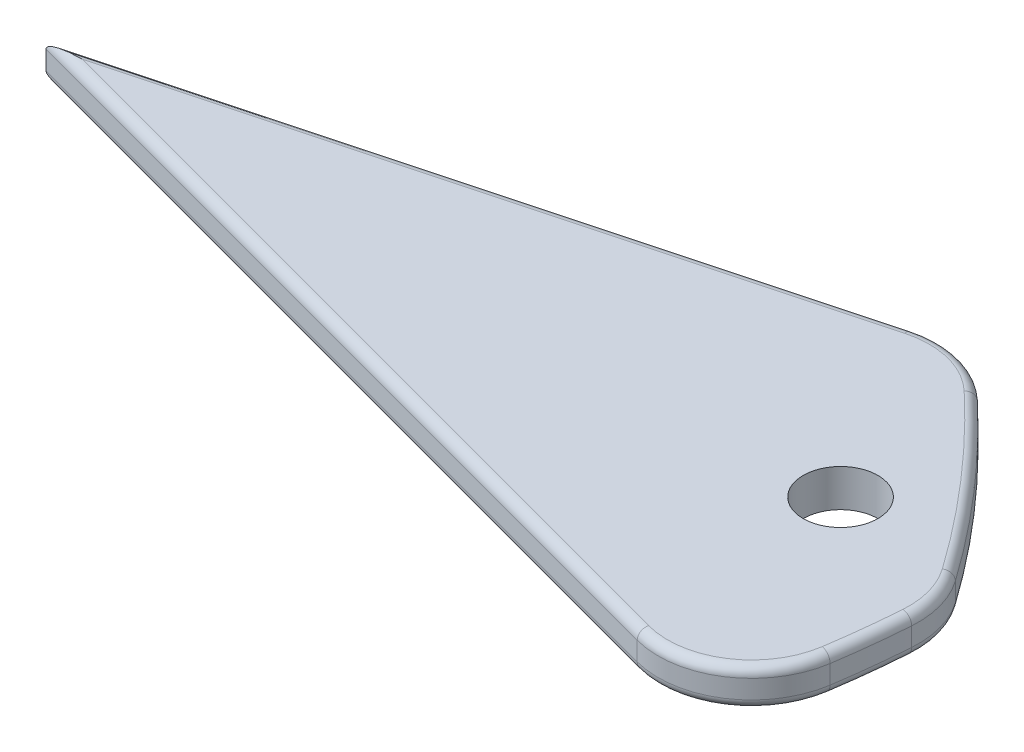
ISO-10303-21;
HEADER;
FILE_DESCRIPTION(('STEP AP214'),'2;1');
FILE_NAME('part.step','',(''),(''),'','','');
FILE_SCHEMA(('AUTOMOTIVE_DESIGN { 1 0 10303 214 1 1 1 1 }'));
ENDSEC;
DATA;
#1=APPLICATION_CONTEXT('core data for automotive mechanical design processes');
#2=APPLICATION_PROTOCOL_DEFINITION('international standard','automotive_design',2000,#1);
#3=PRODUCT_CONTEXT('',#1,'mechanical');
#4=PRODUCT('Part','Part','',(#3));
#5=PRODUCT_RELATED_PRODUCT_CATEGORY('part','',(#4));
#6=PRODUCT_DEFINITION_FORMATION('','',#4);
#7=PRODUCT_DEFINITION_CONTEXT('part definition',#1,'design');
#8=PRODUCT_DEFINITION('design','',#6,#7);
#9=PRODUCT_DEFINITION_SHAPE('','',#8);
#10=(LENGTH_UNIT() NAMED_UNIT(*) SI_UNIT(.MILLI.,.METRE.));
#11=(NAMED_UNIT(*) PLANE_ANGLE_UNIT() SI_UNIT($,.RADIAN.));
#12=(NAMED_UNIT(*) SI_UNIT($,.STERADIAN.) SOLID_ANGLE_UNIT());
#13=UNCERTAINTY_MEASURE_WITH_UNIT(LENGTH_MEASURE(1.E-05),#10,'distance_accuracy_value','');
#14=(GEOMETRIC_REPRESENTATION_CONTEXT(3) GLOBAL_UNCERTAINTY_ASSIGNED_CONTEXT((#13)) GLOBAL_UNIT_ASSIGNED_CONTEXT((#10,
#11,#12)) REPRESENTATION_CONTEXT('',''));
#15=CARTESIAN_POINT('',(0.,0.,0.));
#16=DIRECTION('',(0.,0.,1.));
#17=DIRECTION('',(1.,0.,0.));
#18=AXIS2_PLACEMENT_3D('',#15,#16,#17);
#19=CARTESIAN_POINT('',(0.,-1.,0.));
#20=DIRECTION('',(0.,-1.,0.));
#21=DIRECTION('',(0.,0.,-1.));
#22=AXIS2_PLACEMENT_3D('',#19,#20,#21);
#23=PLANE('',#22);
#24=DIRECTION('',(-0.965925826289068,0.,0.258819045102521));
#25=VECTOR('',#24,1.);
#26=CARTESIAN_POINT('',(36.6352093565327,-1.,-9.29873667142301));
#27=LINE('',#26,#25);
#28=CARTESIAN_POINT('',(1.93185165257814,-1.,0.));
#29=VERTEX_POINT('',#28);
#30=CARTESIAN_POINT('',(36.6352093565327,-1.,-9.29873667142301));
#31=VERTEX_POINT('',#30);
#32=EDGE_CURVE('E234',#29,#31,#27,.F.);
#33=ORIENTED_EDGE('',*,*,#32,.T.);
#34=CARTESIAN_POINT('',(37.799895059494,-1.,-4.95207045312221));
#35=DIRECTION('',(0.,-1.,0.));
#36=DIRECTION('',(0.,0.,-1.));
#37=AXIS2_PLACEMENT_3D('',#34,#35,#36);
#38=CIRCLE('',#37,4.5);
#39=CARTESIAN_POINT('',(40.8926137461799,-1.,-8.22087621746856));
#40=VERTEX_POINT('',#39);
#41=EDGE_CURVE('E246',#31,#40,#38,.T.);
#42=ORIENTED_EDGE('',*,*,#41,.T.);
#43=CARTESIAN_POINT('',(0.,-1.,35.));
#44=DIRECTION('',(0.,-1.,0.));
#45=DIRECTION('',(0.,0.,-1.));
#46=AXIS2_PLACEMENT_3D('',#43,#44,#45);
#47=CIRCLE('',#46,59.5);
#48=CARTESIAN_POINT('',(48.5574710612875,-1.,0.61363636363637));
#49=VERTEX_POINT('',#48);
#50=EDGE_CURVE('E244',#40,#49,#47,.T.);
#51=ORIENTED_EDGE('',*,*,#50,.T.);
#52=CARTESIAN_POINT('',(44.885057283543,-1.,3.21428571428573));
#53=DIRECTION('',(0.,-1.,0.));
#54=DIRECTION('',(0.,0.,-1.));
#55=AXIS2_PLACEMENT_3D('',#52,#53,#54);
#56=CIRCLE('',#55,4.5);
#57=CARTESIAN_POINT('',(49.3735630118973,-1.,3.5357142857143));
#58=VERTEX_POINT('',#57);
#59=EDGE_CURVE('E242',#49,#58,#56,.T.);
#60=ORIENTED_EDGE('',*,*,#59,.T.);
#61=CARTESIAN_POINT('',(0.,-1.,0.));
#62=DIRECTION('',(0.,-1.,0.));
#63=DIRECTION('',(0.,0.,-1.));
#64=AXIS2_PLACEMENT_3D('',#61,#62,#63);
#65=CIRCLE('',#64,49.5);
#66=CARTESIAN_POINT('',(48.9407725417741,-1.,7.41962148726819));
#67=VERTEX_POINT('',#66);
#68=EDGE_CURVE('E240',#58,#67,#65,.T.);
#69=ORIENTED_EDGE('',*,*,#68,.T.);
#70=CARTESIAN_POINT('',(44.4916114016128,-1.,6.74511044297109));
#71=DIRECTION('',(0.,-1.,0.));
#72=DIRECTION('',(0.,0.,-1.));
#73=AXIS2_PLACEMENT_3D('',#70,#71,#72);
#74=CIRCLE('',#73,4.5);
#75=CARTESIAN_POINT('',(43.3269256986515,-1.,11.0917766612719));
#76=VERTEX_POINT('',#75);
#77=EDGE_CURVE('E238',#67,#76,#74,.T.);
#78=ORIENTED_EDGE('',*,*,#77,.T.);
#79=DIRECTION('',(-0.965925826289068,0.,-0.258819045102521));
#80=VECTOR('',#79,1.);
#81=CARTESIAN_POINT('',(0.129409522551261,-1.,-0.482962913144534));
#82=LINE('',#81,#80);
#83=EDGE_CURVE('E236',#76,#29,#82,.T.);
#84=ORIENTED_EDGE('',*,*,#83,.T.);
#85=EDGE_LOOP('',(#33,#42,#51,#60,#69,#78,#84));
#86=FACE_BOUND('',#85,.T.);
#87=CARTESIAN_POINT('',(42.5,-1.,0.));
#88=DIRECTION('',(0.,1.,0.));
#89=DIRECTION('',(0.,0.,1.));
#90=AXIS2_PLACEMENT_3D('',#87,#88,#89);
#91=CIRCLE('',#90,2.);
#92=CARTESIAN_POINT('',(42.5,-1.,2.));
#93=VERTEX_POINT('',#92);
#94=EDGE_CURVE('E187',#93,#93,#91,.T.);
#95=ORIENTED_EDGE('',*,*,#94,.T.);
#96=EDGE_LOOP('',(#95));
#97=FACE_BOUND('',#96,.T.);
#98=DIRECTION('',(0.,0.,-1.));
#99=VECTOR('',#98,1.);
#100=CARTESIAN_POINT('',(37.5,-1.,7.));
#101=LINE('',#100,#99);
#102=CARTESIAN_POINT('',(37.5,-1.,7.));
#103=VERTEX_POINT('',#102);
#104=CARTESIAN_POINT('',(37.5,-1.,-6.99999999999999));
#105=VERTEX_POINT('',#104);
#106=EDGE_CURVE('E637',#103,#105,#101,.T.);
#107=ORIENTED_EDGE('',*,*,#106,.F.);
#108=CARTESIAN_POINT('',(38.,-1.,7.));
#109=DIRECTION('',(0.,-1.,0.));
#110=DIRECTION('',(0.,0.,-1.));
#111=AXIS2_PLACEMENT_3D('',#108,#109,#110);
#112=CIRCLE('',#111,0.5);
#113=CARTESIAN_POINT('',(38.5,-1.,7.));
#114=VERTEX_POINT('',#113);
#115=EDGE_CURVE('E182',#114,#103,#112,.T.);
#116=ORIENTED_EDGE('',*,*,#115,.F.);
#117=DIRECTION('',(0.,0.,1.));
#118=VECTOR('',#117,1.);
#119=CARTESIAN_POINT('',(38.5,-1.,7.));
#120=LINE('',#119,#118);
#121=CARTESIAN_POINT('',(38.5,-1.,-6.99999999999999));
#122=VERTEX_POINT('',#121);
#123=EDGE_CURVE('E178',#122,#114,#120,.T.);
#124=ORIENTED_EDGE('',*,*,#123,.F.);
#125=CARTESIAN_POINT('',(38.,-1.,-6.99999999999999));
#126=DIRECTION('',(0.,-1.,0.));
#127=DIRECTION('',(0.,0.,-1.));
#128=AXIS2_PLACEMENT_3D('',#125,#126,#127);
#129=CIRCLE('',#128,0.5);
#130=EDGE_CURVE('E634',#105,#122,#129,.T.);
#131=ORIENTED_EDGE('',*,*,#130,.F.);
#132=EDGE_LOOP('',(#107,#116,#124,#131));
#133=FACE_BOUND('',#132,.T.);
#134=ADVANCED_FACE('F32',(#86,#97,#133),#23,.T.);
#135=CARTESIAN_POINT('',(0.,1.,0.));
#136=DIRECTION('',(0.,-1.,0.));
#137=DIRECTION('',(0.,0.,-1.));
#138=AXIS2_PLACEMENT_3D('',#135,#136,#137);
#139=PLANE('',#138);
#140=CARTESIAN_POINT('',(0.,1.,35.));
#141=DIRECTION('',(0.,-1.,0.));
#142=DIRECTION('',(0.,0.,-1.));
#143=AXIS2_PLACEMENT_3D('',#140,#141,#142);
#144=CIRCLE('',#143,59.5);
#145=CARTESIAN_POINT('',(48.5574710612875,1.,0.613636363636371));
#146=VERTEX_POINT('',#145);
#147=CARTESIAN_POINT('',(40.8926137461799,1.,-8.22087621746856));
#148=VERTEX_POINT('',#147);
#149=EDGE_CURVE('E221',#146,#148,#144,.F.);
#150=ORIENTED_EDGE('',*,*,#149,.T.);
#151=CARTESIAN_POINT('',(37.799895059494,1.,-4.95207045312221));
#152=DIRECTION('',(0.,-1.,0.));
#153=DIRECTION('',(0.,0.,-1.));
#154=AXIS2_PLACEMENT_3D('',#151,#152,#153);
#155=CIRCLE('',#154,4.5);
#156=CARTESIAN_POINT('',(36.6352093565327,1.,-9.29873667142301));
#157=VERTEX_POINT('',#156);
#158=EDGE_CURVE('E225',#148,#157,#155,.F.);
#159=ORIENTED_EDGE('',*,*,#158,.T.);
#160=DIRECTION('',(-0.965925826289068,0.,0.258819045102521));
#161=VECTOR('',#160,1.);
#162=CARTESIAN_POINT('',(0.129409522551261,1.,0.482962913144534));
#163=LINE('',#162,#161);
#164=CARTESIAN_POINT('',(1.93185165257814,1.,0.));
#165=VERTEX_POINT('',#164);
#166=EDGE_CURVE('E223',#157,#165,#163,.T.);
#167=ORIENTED_EDGE('',*,*,#166,.T.);
#168=DIRECTION('',(-0.965925826289068,0.,-0.258819045102521));
#169=VECTOR('',#168,1.);
#170=CARTESIAN_POINT('',(43.3269256986515,1.,11.0917766612719));
#171=LINE('',#170,#169);
#172=CARTESIAN_POINT('',(43.3269256986515,1.,11.0917766612719));
#173=VERTEX_POINT('',#172);
#174=EDGE_CURVE('E213',#165,#173,#171,.F.);
#175=ORIENTED_EDGE('',*,*,#174,.T.);
#176=CARTESIAN_POINT('',(44.4916114016128,1.,6.74511044297109));
#177=DIRECTION('',(0.,-1.,0.));
#178=DIRECTION('',(0.,0.,-1.));
#179=AXIS2_PLACEMENT_3D('',#176,#177,#178);
#180=CIRCLE('',#179,4.5);
#181=CARTESIAN_POINT('',(48.9407725417741,1.,7.41962148726819));
#182=VERTEX_POINT('',#181);
#183=EDGE_CURVE('E215',#173,#182,#180,.F.);
#184=ORIENTED_EDGE('',*,*,#183,.T.);
#185=CARTESIAN_POINT('',(0.,1.,0.));
#186=DIRECTION('',(0.,-1.,0.));
#187=DIRECTION('',(0.,0.,-1.));
#188=AXIS2_PLACEMENT_3D('',#185,#186,#187);
#189=CIRCLE('',#188,49.5);
#190=CARTESIAN_POINT('',(49.3735630118973,1.,3.5357142857143));
#191=VERTEX_POINT('',#190);
#192=EDGE_CURVE('E217',#182,#191,#189,.F.);
#193=ORIENTED_EDGE('',*,*,#192,.T.);
#194=CARTESIAN_POINT('',(44.885057283543,1.,3.21428571428573));
#195=DIRECTION('',(0.,-1.,0.));
#196=DIRECTION('',(0.,0.,-1.));
#197=AXIS2_PLACEMENT_3D('',#194,#195,#196);
#198=CIRCLE('',#197,4.5);
#199=EDGE_CURVE('E219',#191,#146,#198,.F.);
#200=ORIENTED_EDGE('',*,*,#199,.T.);
#201=EDGE_LOOP('',(#150,#159,#167,#175,#184,#193,#200));
#202=FACE_BOUND('',#201,.T.);
#203=CARTESIAN_POINT('',(42.5,1.,0.));
#204=DIRECTION('',(0.,1.,0.));
#205=DIRECTION('',(0.,0.,1.));
#206=AXIS2_PLACEMENT_3D('',#203,#204,#205);
#207=CIRCLE('',#206,2.);
#208=CARTESIAN_POINT('',(42.5,1.,2.));
#209=VERTEX_POINT('',#208);
#210=EDGE_CURVE('E184',#209,#209,#207,.T.);
#211=ORIENTED_EDGE('',*,*,#210,.F.);
#212=EDGE_LOOP('',(#211));
#213=FACE_BOUND('',#212,.T.);
#214=ADVANCED_FACE('F403',(#202,#213),#139,.F.);
#215=CARTESIAN_POINT('',(48.2962913144534,1.,-12.9409522551261));
#216=DIRECTION('',(0.258819045102521,0.,0.965925826289068));
#217=DIRECTION('',(0.965925826289068,0.,-0.258819045102521));
#218=AXIS2_PLACEMENT_3D('',#215,#216,#217);
#219=PLANE('',#218);
#220=DIRECTION('',(0.,-1.,0.));
#221=VECTOR('',#220,1.);
#222=CARTESIAN_POINT('',(36.5057998339814,-1.,-9.78169958456754));
#223=LINE('',#222,#221);
#224=CARTESIAN_POINT('',(36.5057998339814,0.5,-9.78169958456754));
#225=VERTEX_POINT('',#224);
#226=CARTESIAN_POINT('',(36.5057998339814,-0.5,-9.78169958456754));
#227=VERTEX_POINT('',#226);
#228=EDGE_CURVE('E197',#225,#227,#223,.T.);
#229=ORIENTED_EDGE('',*,*,#228,.T.);
#230=DIRECTION('',(-0.965925826289068,0.,0.258819045102521));
#231=VECTOR('',#230,1.);
#232=CARTESIAN_POINT('',(0.,-0.5,0.));
#233=LINE('',#232,#231);
#234=CARTESIAN_POINT('',(0.,-0.5,0.));
#235=VERTEX_POINT('',#234);
#236=EDGE_CURVE('E11',#227,#235,#233,.T.);
#237=ORIENTED_EDGE('',*,*,#236,.T.);
#238=DIRECTION('',(0.,-1.,0.));
#239=VECTOR('',#238,1.);
#240=CARTESIAN_POINT('',(0.,1.,0.));
#241=LINE('',#240,#239);
#242=CARTESIAN_POINT('',(0.,0.5,0.));
#243=VERTEX_POINT('',#242);
#244=EDGE_CURVE('E194',#243,#235,#241,.T.);
#245=ORIENTED_EDGE('',*,*,#244,.F.);
#246=DIRECTION('',(-0.965925826289068,0.,0.258819045102521));
#247=VECTOR('',#246,1.);
#248=CARTESIAN_POINT('',(48.2962913144534,0.5,-12.9409522551261));
#249=LINE('',#248,#247);
#250=EDGE_CURVE('E41',#243,#225,#249,.F.);
#251=ORIENTED_EDGE('',*,*,#250,.T.);
#252=EDGE_LOOP('',(#229,#237,#245,#251));
#253=FACE_BOUND('',#252,.T.);
#254=ADVANCED_FACE('F366',(#253),#219,.F.);
#255=CARTESIAN_POINT('',(48.2962913144534,1.,12.9409522551261));
#256=DIRECTION('',(-0.258819045102521,0.,0.965925826289068));
#257=DIRECTION('',(0.965925826289068,0.,0.258819045102521));
#258=AXIS2_PLACEMENT_3D('',#255,#256,#257);
#259=PLANE('',#258);
#260=ORIENTED_EDGE('',*,*,#244,.T.);
#261=DIRECTION('',(-0.965925826289068,0.,-0.258819045102521));
#262=VECTOR('',#261,1.);
#263=CARTESIAN_POINT('',(48.2962913144534,-0.5,12.9409522551261));
#264=LINE('',#263,#262);
#265=CARTESIAN_POINT('',(43.1975161761002,-0.5,11.5747395744164));
#266=VERTEX_POINT('',#265);
#267=EDGE_CURVE('E266',#235,#266,#264,.F.);
#268=ORIENTED_EDGE('',*,*,#267,.T.);
#269=DIRECTION('',(0.,-1.,0.));
#270=VECTOR('',#269,1.);
#271=CARTESIAN_POINT('',(43.1975161761002,1.,11.5747395744164));
#272=LINE('',#271,#270);
#273=CARTESIAN_POINT('',(43.1975161761002,0.5,11.5747395744164));
#274=VERTEX_POINT('',#273);
#275=EDGE_CURVE('E211',#266,#274,#272,.F.);
#276=ORIENTED_EDGE('',*,*,#275,.T.);
#277=DIRECTION('',(-0.965925826289068,0.,-0.258819045102521));
#278=VECTOR('',#277,1.);
#279=CARTESIAN_POINT('',(0.,0.5,0.));
#280=LINE('',#279,#278);
#281=EDGE_CURVE('E54',#274,#243,#280,.T.);
#282=ORIENTED_EDGE('',*,*,#281,.T.);
#283=EDGE_LOOP('',(#260,#268,#276,#282));
#284=FACE_BOUND('',#283,.T.);
#285=ADVANCED_FACE('F347',(#284),#259,.T.);
#286=CARTESIAN_POINT('',(0.,1.,0.));
#287=DIRECTION('',(0.,-1.,0.));
#288=DIRECTION('',(0.,0.,-1.));
#289=AXIS2_PLACEMENT_3D('',#286,#287,#288);
#290=CYLINDRICAL_SURFACE('',#289,50.);
#291=DIRECTION('',(0.,-1.,0.));
#292=VECTOR('',#291,1.);
#293=CARTESIAN_POINT('',(49.4351237795698,1.,7.49456715885676));
#294=LINE('',#293,#292);
#295=CARTESIAN_POINT('',(49.4351237795698,0.5,7.49456715885676));
#296=VERTEX_POINT('',#295);
#297=CARTESIAN_POINT('',(49.4351237795698,-0.5,7.49456715885676));
#298=VERTEX_POINT('',#297);
#299=EDGE_CURVE('E205',#296,#298,#294,.T.);
#300=ORIENTED_EDGE('',*,*,#299,.T.);
#301=CARTESIAN_POINT('',(0.,-0.5,0.));
#302=DIRECTION('',(0.,-1.,0.));
#303=DIRECTION('',(0.,0.,-1.));
#304=AXIS2_PLACEMENT_3D('',#301,#302,#303);
#305=CIRCLE('',#304,50.);
#306=CARTESIAN_POINT('',(49.8722858706034,-0.5,3.57142857142858));
#307=VERTEX_POINT('',#306);
#308=EDGE_CURVE('E259',#298,#307,#305,.F.);
#309=ORIENTED_EDGE('',*,*,#308,.T.);
#310=DIRECTION('',(0.,-1.,0.));
#311=VECTOR('',#310,1.);
#312=CARTESIAN_POINT('',(49.8722858706034,1.,3.57142857142858));
#313=LINE('',#312,#311);
#314=CARTESIAN_POINT('',(49.8722858706034,0.5,3.57142857142858));
#315=VERTEX_POINT('',#314);
#316=EDGE_CURVE('E208',#307,#315,#313,.F.);
#317=ORIENTED_EDGE('',*,*,#316,.T.);
#318=CARTESIAN_POINT('',(0.,0.5,0.));
#319=DIRECTION('',(0.,-1.,0.));
#320=DIRECTION('',(0.,0.,-1.));
#321=AXIS2_PLACEMENT_3D('',#318,#319,#320);
#322=CIRCLE('',#321,50.);
#323=EDGE_CURVE('E257',#315,#296,#322,.T.);
#324=ORIENTED_EDGE('',*,*,#323,.T.);
#325=EDGE_LOOP('',(#300,#309,#317,#324));
#326=FACE_BOUND('',#325,.T.);
#327=ADVANCED_FACE('F389',(#326),#290,.T.);
#328=CARTESIAN_POINT('',(42.5,-1.,0.));
#329=DIRECTION('',(0.,1.,0.));
#330=DIRECTION('',(0.,0.,1.));
#331=AXIS2_PLACEMENT_3D('',#328,#329,#330);
#332=CYLINDRICAL_SURFACE('',#331,2.);
#333=ORIENTED_EDGE('',*,*,#94,.F.);
#334=EDGE_LOOP('',(#333));
#335=FACE_BOUND('',#334,.T.);
#336=ORIENTED_EDGE('',*,*,#210,.T.);
#337=EDGE_LOOP('',(#336));
#338=FACE_BOUND('',#337,.T.);
#339=ADVANCED_FACE('F391',(#335,#338),#332,.F.);
#340=CARTESIAN_POINT('',(38.,-1.5,7.));
#341=DIRECTION('',(0.,1.,0.));
#342=DIRECTION('',(0.,0.,1.));
#343=AXIS2_PLACEMENT_3D('',#340,#341,#342);
#344=CYLINDRICAL_SURFACE('',#343,0.5);
#345=ORIENTED_EDGE('',*,*,#115,.T.);
#346=DIRECTION('',(0.,1.,0.));
#347=VECTOR('',#346,1.);
#348=CARTESIAN_POINT('',(37.5,-1.5,7.));
#349=LINE('',#348,#347);
#350=CARTESIAN_POINT('',(37.5,-1.5,7.));
#351=VERTEX_POINT('',#350);
#352=EDGE_CURVE('E162',#351,#103,#349,.T.);
#353=ORIENTED_EDGE('',*,*,#352,.F.);
#354=CARTESIAN_POINT('',(38.,-1.5,7.));
#355=DIRECTION('',(0.,-1.,0.));
#356=DIRECTION('',(0.,0.,-1.));
#357=AXIS2_PLACEMENT_3D('',#354,#355,#356);
#358=CIRCLE('',#357,0.5);
#359=CARTESIAN_POINT('',(38.5,-1.5,7.));
#360=VERTEX_POINT('',#359);
#361=EDGE_CURVE('E169',#360,#351,#358,.T.);
#362=ORIENTED_EDGE('',*,*,#361,.F.);
#363=DIRECTION('',(0.,1.,0.));
#364=VECTOR('',#363,1.);
#365=CARTESIAN_POINT('',(38.5,-1.5,7.));
#366=LINE('',#365,#364);
#367=EDGE_CURVE('E629',#360,#114,#366,.T.);
#368=ORIENTED_EDGE('',*,*,#367,.T.);
#369=EDGE_LOOP('',(#345,#353,#362,#368));
#370=FACE_BOUND('',#369,.T.);
#371=ADVANCED_FACE('F180',(#370),#344,.T.);
#372=CARTESIAN_POINT('',(37.5,-1.5,7.));
#373=DIRECTION('',(1.,0.,0.));
#374=DIRECTION('',(0.,0.,-1.));
#375=AXIS2_PLACEMENT_3D('',#372,#373,#374);
#376=PLANE('',#375);
#377=ORIENTED_EDGE('',*,*,#106,.T.);
#378=DIRECTION('',(0.,1.,0.));
#379=VECTOR('',#378,1.);
#380=CARTESIAN_POINT('',(37.5,-1.5,-6.99999999999999));
#381=LINE('',#380,#379);
#382=CARTESIAN_POINT('',(37.5,-1.5,-6.99999999999999));
#383=VERTEX_POINT('',#382);
#384=EDGE_CURVE('E165',#383,#105,#381,.T.);
#385=ORIENTED_EDGE('',*,*,#384,.F.);
#386=DIRECTION('',(0.,0.,-1.));
#387=VECTOR('',#386,1.);
#388=CARTESIAN_POINT('',(37.5,-1.5,7.));
#389=LINE('',#388,#387);
#390=EDGE_CURVE('E158',#351,#383,#389,.T.);
#391=ORIENTED_EDGE('',*,*,#390,.F.);
#392=ORIENTED_EDGE('',*,*,#352,.T.);
#393=EDGE_LOOP('',(#377,#385,#391,#392));
#394=FACE_BOUND('',#393,.T.);
#395=ADVANCED_FACE('F160',(#394),#376,.F.);
#396=CARTESIAN_POINT('',(38.,-1.5,-6.99999999999999));
#397=DIRECTION('',(0.,1.,0.));
#398=DIRECTION('',(0.,0.,1.));
#399=AXIS2_PLACEMENT_3D('',#396,#397,#398);
#400=CYLINDRICAL_SURFACE('',#399,0.5);
#401=ORIENTED_EDGE('',*,*,#130,.T.);
#402=DIRECTION('',(0.,1.,0.));
#403=VECTOR('',#402,1.);
#404=CARTESIAN_POINT('',(38.5,-1.5,-6.99999999999999));
#405=LINE('',#404,#403);
#406=CARTESIAN_POINT('',(38.5,-1.5,-6.99999999999999));
#407=VERTEX_POINT('',#406);
#408=EDGE_CURVE('E189',#407,#122,#405,.T.);
#409=ORIENTED_EDGE('',*,*,#408,.F.);
#410=CARTESIAN_POINT('',(38.,-1.5,-6.99999999999999));
#411=DIRECTION('',(0.,-1.,0.));
#412=DIRECTION('',(0.,0.,-1.));
#413=AXIS2_PLACEMENT_3D('',#410,#411,#412);
#414=CIRCLE('',#413,0.5);
#415=EDGE_CURVE('E168',#383,#407,#414,.T.);
#416=ORIENTED_EDGE('',*,*,#415,.F.);
#417=ORIENTED_EDGE('',*,*,#384,.T.);
#418=EDGE_LOOP('',(#401,#409,#416,#417));
#419=FACE_BOUND('',#418,.T.);
#420=ADVANCED_FACE('F415',(#419),#400,.T.);
#421=CARTESIAN_POINT('',(38.5,-1.5,7.));
#422=DIRECTION('',(-1.,0.,0.));
#423=DIRECTION('',(0.,0.,1.));
#424=AXIS2_PLACEMENT_3D('',#421,#422,#423);
#425=PLANE('',#424);
#426=ORIENTED_EDGE('',*,*,#123,.T.);
#427=ORIENTED_EDGE('',*,*,#367,.F.);
#428=DIRECTION('',(0.,0.,1.));
#429=VECTOR('',#428,1.);
#430=CARTESIAN_POINT('',(38.5,-1.5,7.));
#431=LINE('',#430,#429);
#432=EDGE_CURVE('E174',#407,#360,#431,.T.);
#433=ORIENTED_EDGE('',*,*,#432,.F.);
#434=ORIENTED_EDGE('',*,*,#408,.T.);
#435=EDGE_LOOP('',(#426,#427,#433,#434));
#436=FACE_BOUND('',#435,.T.);
#437=ADVANCED_FACE('F418',(#436),#425,.F.);
#438=CARTESIAN_POINT('',(38.,-1.5,7.));
#439=DIRECTION('',(0.,-1.,0.));
#440=DIRECTION('',(0.,0.,-1.));
#441=AXIS2_PLACEMENT_3D('',#438,#439,#440);
#442=PLANE('',#441);
#443=ORIENTED_EDGE('',*,*,#361,.T.);
#444=ORIENTED_EDGE('',*,*,#390,.T.);
#445=ORIENTED_EDGE('',*,*,#415,.T.);
#446=ORIENTED_EDGE('',*,*,#432,.T.);
#447=EDGE_LOOP('',(#443,#444,#445,#446));
#448=FACE_BOUND('',#447,.T.);
#449=ADVANCED_FACE('F172',(#448),#442,.T.);
#450=CARTESIAN_POINT('',(0.,-1.501,35.));
#451=DIRECTION('',(0.,1.,0.));
#452=DIRECTION('',(0.,0.,1.));
#453=AXIS2_PLACEMENT_3D('',#450,#451,#452);
#454=CYLINDRICAL_SURFACE('',#453,60.);
#455=DIRECTION('',(0.,1.,0.));
#456=VECTOR('',#455,1.);
#457=CARTESIAN_POINT('',(48.9655170365924,-1.501,0.324675324675325));
#458=LINE('',#457,#456);
#459=CARTESIAN_POINT('',(48.9655170365924,0.5,0.324675324675325));
#460=VERTEX_POINT('',#459);
#461=CARTESIAN_POINT('',(48.9655170365924,-0.5,0.324675324675325));
#462=VERTEX_POINT('',#461);
#463=EDGE_CURVE('E199',#460,#462,#458,.F.);
#464=ORIENTED_EDGE('',*,*,#463,.T.);
#465=CARTESIAN_POINT('',(0.,-0.5,35.));
#466=DIRECTION('',(0.,-1.,0.));
#467=DIRECTION('',(0.,0.,-1.));
#468=AXIS2_PLACEMENT_3D('',#465,#466,#467);
#469=CIRCLE('',#468,60.);
#470=CARTESIAN_POINT('',(41.2362491558116,-0.5,-8.5840768579515));
#471=VERTEX_POINT('',#470);
#472=EDGE_CURVE('E251',#462,#471,#469,.F.);
#473=ORIENTED_EDGE('',*,*,#472,.T.);
#474=DIRECTION('',(0.,1.,0.));
#475=VECTOR('',#474,1.);
#476=CARTESIAN_POINT('',(41.2362491558116,-1.501,-8.5840768579515));
#477=LINE('',#476,#475);
#478=CARTESIAN_POINT('',(41.2362491558116,0.5,-8.5840768579515));
#479=VERTEX_POINT('',#478);
#480=EDGE_CURVE('E202',#471,#479,#477,.T.);
#481=ORIENTED_EDGE('',*,*,#480,.T.);
#482=CARTESIAN_POINT('',(0.,0.5,35.));
#483=DIRECTION('',(0.,-1.,0.));
#484=DIRECTION('',(0.,0.,-1.));
#485=AXIS2_PLACEMENT_3D('',#482,#483,#484);
#486=CIRCLE('',#485,60.);
#487=EDGE_CURVE('E249',#479,#460,#486,.T.);
#488=ORIENTED_EDGE('',*,*,#487,.T.);
#489=EDGE_LOOP('',(#464,#473,#481,#488));
#490=FACE_BOUND('',#489,.T.);
#491=ADVANCED_FACE('F331',(#490),#454,.T.);
#492=CARTESIAN_POINT('',(37.799895059494,-1.501,-4.95207045312221));
#493=DIRECTION('',(0.,1.,0.));
#494=DIRECTION('',(0.,0.,1.));
#495=AXIS2_PLACEMENT_3D('',#492,#493,#494);
#496=CYLINDRICAL_SURFACE('',#495,5.);
#497=ORIENTED_EDGE('',*,*,#228,.F.);
#498=CARTESIAN_POINT('',(37.799895059494,0.5,-4.95207045312221));
#499=DIRECTION('',(0.,-1.,0.));
#500=DIRECTION('',(0.,0.,-1.));
#501=AXIS2_PLACEMENT_3D('',#498,#499,#500);
#502=CIRCLE('',#501,5.);
#503=EDGE_CURVE('E231',#225,#479,#502,.T.);
#504=ORIENTED_EDGE('',*,*,#503,.T.);
#505=ORIENTED_EDGE('',*,*,#480,.F.);
#506=CARTESIAN_POINT('',(37.799895059494,-0.5,-4.95207045312221));
#507=DIRECTION('',(0.,-1.,0.));
#508=DIRECTION('',(0.,0.,-1.));
#509=AXIS2_PLACEMENT_3D('',#506,#507,#508);
#510=CIRCLE('',#509,5.);
#511=EDGE_CURVE('E228',#471,#227,#510,.F.);
#512=ORIENTED_EDGE('',*,*,#511,.T.);
#513=EDGE_LOOP('',(#497,#504,#505,#512));
#514=FACE_BOUND('',#513,.T.);
#515=ADVANCED_FACE('F336',(#514),#496,.T.);
#516=CARTESIAN_POINT('',(44.885057283543,1.,3.21428571428573));
#517=DIRECTION('',(0.,-1.,0.));
#518=DIRECTION('',(0.,0.,-1.));
#519=AXIS2_PLACEMENT_3D('',#516,#517,#518);
#520=CYLINDRICAL_SURFACE('',#519,5.);
#521=ORIENTED_EDGE('',*,*,#316,.F.);
#522=CARTESIAN_POINT('',(44.885057283543,-0.5,3.21428571428573));
#523=DIRECTION('',(0.,-1.,0.));
#524=DIRECTION('',(0.,0.,-1.));
#525=AXIS2_PLACEMENT_3D('',#522,#523,#524);
#526=CIRCLE('',#525,5.);
#527=EDGE_CURVE('E255',#307,#462,#526,.F.);
#528=ORIENTED_EDGE('',*,*,#527,.T.);
#529=ORIENTED_EDGE('',*,*,#463,.F.);
#530=CARTESIAN_POINT('',(44.885057283543,0.5,3.21428571428573));
#531=DIRECTION('',(0.,-1.,0.));
#532=DIRECTION('',(0.,0.,-1.));
#533=AXIS2_PLACEMENT_3D('',#530,#531,#532);
#534=CIRCLE('',#533,5.);
#535=EDGE_CURVE('E253',#460,#315,#534,.T.);
#536=ORIENTED_EDGE('',*,*,#535,.T.);
#537=EDGE_LOOP('',(#521,#528,#529,#536));
#538=FACE_BOUND('',#537,.T.);
#539=ADVANCED_FACE('F379',(#538),#520,.T.);
#540=CARTESIAN_POINT('',(44.4916114016128,1.,6.74511044297109));
#541=DIRECTION('',(0.,-1.,0.));
#542=DIRECTION('',(0.,0.,-1.));
#543=AXIS2_PLACEMENT_3D('',#540,#541,#542);
#544=CYLINDRICAL_SURFACE('',#543,5.);
#545=ORIENTED_EDGE('',*,*,#275,.F.);
#546=CARTESIAN_POINT('',(44.4916114016128,-0.5,6.74511044297109));
#547=DIRECTION('',(0.,-1.,0.));
#548=DIRECTION('',(0.,0.,-1.));
#549=AXIS2_PLACEMENT_3D('',#546,#547,#548);
#550=CIRCLE('',#549,5.);
#551=EDGE_CURVE('E263',#266,#298,#550,.F.);
#552=ORIENTED_EDGE('',*,*,#551,.T.);
#553=ORIENTED_EDGE('',*,*,#299,.F.);
#554=CARTESIAN_POINT('',(44.4916114016128,0.5,6.74511044297109));
#555=DIRECTION('',(0.,-1.,0.));
#556=DIRECTION('',(0.,0.,-1.));
#557=AXIS2_PLACEMENT_3D('',#554,#555,#556);
#558=CIRCLE('',#557,5.);
#559=EDGE_CURVE('E261',#296,#274,#558,.T.);
#560=ORIENTED_EDGE('',*,*,#559,.T.);
#561=EDGE_LOOP('',(#545,#552,#553,#560));
#562=FACE_BOUND('',#561,.T.);
#563=ADVANCED_FACE('F350',(#562),#544,.T.);
#564=CARTESIAN_POINT('',(0.,0.5,0.));
#565=DIRECTION('',(0.,-1.,0.));
#566=DIRECTION('',(0.,0.,-1.));
#567=AXIS2_PLACEMENT_3D('',#564,#565,#566);
#568=TOROIDAL_SURFACE('',#567,49.5,0.5);
#569=CARTESIAN_POINT('',(49.3735630118973,0.5,3.5357142857143));
#570=DIRECTION('',(0.0714285714285716,0.,-0.997445717412067));
#571=DIRECTION('',(-0.997445717412067,0.,-0.0714285714285716));
#572=AXIS2_PLACEMENT_3D('',#569,#570,#571);
#573=CIRCLE('',#572,0.5);
#574=EDGE_CURVE('E282',#191,#315,#573,.T.);
#575=ORIENTED_EDGE('',*,*,#574,.F.);
#576=ORIENTED_EDGE('',*,*,#192,.F.);
#577=CARTESIAN_POINT('',(48.9407725417741,0.5,7.41962148726819));
#578=DIRECTION('',(-0.149891343177136,0.,0.988702475591396));
#579=DIRECTION('',(0.988702475591396,0.,0.149891343177136));
#580=AXIS2_PLACEMENT_3D('',#577,#578,#579);
#581=CIRCLE('',#580,0.5);
#582=EDGE_CURVE('E285',#296,#182,#581,.T.);
#583=ORIENTED_EDGE('',*,*,#582,.F.);
#584=ORIENTED_EDGE('',*,*,#323,.F.);
#585=EDGE_LOOP('',(#575,#576,#583,#584));
#586=FACE_BOUND('',#585,.T.);
#587=ADVANCED_FACE('F387',(#586),#568,.T.);
#588=CARTESIAN_POINT('',(44.4916114016128,0.5,6.74511044297109));
#589=DIRECTION('',(0.,-1.,0.));
#590=DIRECTION('',(0.,0.,-1.));
#591=AXIS2_PLACEMENT_3D('',#588,#589,#590);
#592=TOROIDAL_SURFACE('',#591,4.5,0.5);
#593=ORIENTED_EDGE('',*,*,#582,.T.);
#594=ORIENTED_EDGE('',*,*,#183,.F.);
#595=CARTESIAN_POINT('',(43.3269256986515,0.5,11.0917766612719));
#596=DIRECTION('',(-0.965925826289067,0.,-0.258819045102526));
#597=DIRECTION('',(-0.258819045102526,0.,0.965925826289067));
#598=AXIS2_PLACEMENT_3D('',#595,#596,#597);
#599=CIRCLE('',#598,0.5);
#600=EDGE_CURVE('E279',#274,#173,#599,.T.);
#601=ORIENTED_EDGE('',*,*,#600,.F.);
#602=ORIENTED_EDGE('',*,*,#559,.F.);
#603=EDGE_LOOP('',(#593,#594,#601,#602));
#604=FACE_BOUND('',#603,.T.);
#605=ADVANCED_FACE('F355',(#604),#592,.T.);
#606=CARTESIAN_POINT('',(44.885057283543,0.5,3.21428571428573));
#607=DIRECTION('',(0.,-1.,0.));
#608=DIRECTION('',(0.,0.,-1.));
#609=AXIS2_PLACEMENT_3D('',#606,#607,#608);
#610=TOROIDAL_SURFACE('',#609,4.5,0.5);
#611=ORIENTED_EDGE('',*,*,#574,.T.);
#612=ORIENTED_EDGE('',*,*,#535,.F.);
#613=CARTESIAN_POINT('',(48.5574710612875,0.5,0.613636363636371));
#614=DIRECTION('',(-0.577922077922083,0.,-0.81609195060987));
#615=DIRECTION('',(-0.816091950609869,0.,0.577922077922083));
#616=AXIS2_PLACEMENT_3D('',#613,#614,#615);
#617=CIRCLE('',#616,0.5);
#618=EDGE_CURVE('E276',#146,#460,#617,.T.);
#619=ORIENTED_EDGE('',*,*,#618,.F.);
#620=ORIENTED_EDGE('',*,*,#199,.F.);
#621=EDGE_LOOP('',(#611,#612,#619,#620));
#622=FACE_BOUND('',#621,.T.);
#623=ADVANCED_FACE('F381',(#622),#610,.T.);
#624=CARTESIAN_POINT('',(48.4257008370047,0.5,12.4579893419815));
#625=DIRECTION('',(0.965925826289068,0.,0.258819045102521));
#626=DIRECTION('',(0.258819045102521,0.,-0.965925826289068));
#627=AXIS2_PLACEMENT_3D('',#624,#625,#626);
#628=CYLINDRICAL_SURFACE('',#627,0.5);
#629=ORIENTED_EDGE('',*,*,#600,.T.);
#630=ORIENTED_EDGE('',*,*,#174,.F.);
#631=CARTESIAN_POINT('',(1.93185165257819,0.5,0.));
#632=DIRECTION('',(0.,0.,1.));
#633=DIRECTION('',(1.,0.,0.));
#634=AXIS2_PLACEMENT_3D('',#631,#632,#633);
#635=ELLIPSE('',#634,1.93185165257814,0.5);
#636=EDGE_CURVE('E273',#243,#165,#635,.F.);
#637=ORIENTED_EDGE('',*,*,#636,.F.);
#638=ORIENTED_EDGE('',*,*,#281,.F.);
#639=EDGE_LOOP('',(#629,#630,#637,#638));
#640=FACE_BOUND('',#639,.T.);
#641=ADVANCED_FACE('F360',(#640),#628,.T.);
#642=CARTESIAN_POINT('',(0.,0.5,35.));
#643=DIRECTION('',(0.,-1.,0.));
#644=DIRECTION('',(0.,0.,-1.));
#645=AXIS2_PLACEMENT_3D('',#642,#643,#644);
#646=TOROIDAL_SURFACE('',#645,59.5,0.5);
#647=ORIENTED_EDGE('',*,*,#618,.T.);
#648=ORIENTED_EDGE('',*,*,#487,.F.);
#649=CARTESIAN_POINT('',(40.8926137461799,0.5,-8.22087621746856));
#650=DIRECTION('',(-0.72640128096586,0.,-0.687270819263526));
#651=DIRECTION('',(-0.687270819263526,0.,0.72640128096586));
#652=AXIS2_PLACEMENT_3D('',#649,#650,#651);
#653=CIRCLE('',#652,0.5);
#654=EDGE_CURVE('E271',#148,#479,#653,.T.);
#655=ORIENTED_EDGE('',*,*,#654,.F.);
#656=ORIENTED_EDGE('',*,*,#149,.F.);
#657=EDGE_LOOP('',(#647,#648,#655,#656));
#658=FACE_BOUND('',#657,.T.);
#659=ADVANCED_FACE('F374',(#658),#646,.T.);
#660=CARTESIAN_POINT('',(0.129409522551261,0.5,0.482962913144534));
#661=DIRECTION('',(-0.965925826289068,0.,0.258819045102521));
#662=DIRECTION('',(0.258819045102521,0.,0.965925826289068));
#663=AXIS2_PLACEMENT_3D('',#660,#661,#662);
#664=CYLINDRICAL_SURFACE('',#663,0.5);
#665=ORIENTED_EDGE('',*,*,#636,.T.);
#666=ORIENTED_EDGE('',*,*,#166,.F.);
#667=CARTESIAN_POINT('',(36.6352093565327,0.5,-9.29873667142301));
#668=DIRECTION('',(0.965925826289067,0.,-0.258819045102526));
#669=DIRECTION('',(-0.258819045102526,0.,-0.965925826289067));
#670=AXIS2_PLACEMENT_3D('',#667,#668,#669);
#671=CIRCLE('',#670,0.5);
#672=EDGE_CURVE('E269',#225,#157,#671,.T.);
#673=ORIENTED_EDGE('',*,*,#672,.F.);
#674=ORIENTED_EDGE('',*,*,#250,.F.);
#675=EDGE_LOOP('',(#665,#666,#673,#674));
#676=FACE_BOUND('',#675,.T.);
#677=ADVANCED_FACE('F365',(#676),#664,.T.);
#678=CARTESIAN_POINT('',(37.799895059494,0.5,-4.95207045312221));
#679=DIRECTION('',(0.,-1.,0.));
#680=DIRECTION('',(0.,0.,-1.));
#681=AXIS2_PLACEMENT_3D('',#678,#679,#680);
#682=TOROIDAL_SURFACE('',#681,4.5,0.5);
#683=ORIENTED_EDGE('',*,*,#654,.T.);
#684=ORIENTED_EDGE('',*,*,#503,.F.);
#685=ORIENTED_EDGE('',*,*,#672,.T.);
#686=ORIENTED_EDGE('',*,*,#158,.F.);
#687=EDGE_LOOP('',(#683,#684,#685,#686));
#688=FACE_BOUND('',#687,.T.);
#689=ADVANCED_FACE('F368',(#688),#682,.T.);
#690=CARTESIAN_POINT('',(44.4916114016128,-0.5,6.74511044297109));
#691=DIRECTION('',(0.,-1.,0.));
#692=DIRECTION('',(0.,0.,-1.));
#693=AXIS2_PLACEMENT_3D('',#690,#691,#692);
#694=TOROIDAL_SURFACE('',#693,4.5,0.5);
#695=CARTESIAN_POINT('',(43.3269256986515,-0.5,11.0917766612719));
#696=DIRECTION('',(-0.965925826289067,0.,-0.258819045102526));
#697=DIRECTION('',(-0.258819045102526,0.,0.965925826289067));
#698=AXIS2_PLACEMENT_3D('',#695,#696,#697);
#699=CIRCLE('',#698,0.5);
#700=EDGE_CURVE('E300',#76,#266,#699,.T.);
#701=ORIENTED_EDGE('',*,*,#700,.F.);
#702=ORIENTED_EDGE('',*,*,#77,.F.);
#703=CARTESIAN_POINT('',(48.9407725417741,-0.5,7.41962148726819));
#704=DIRECTION('',(0.149891343177136,0.,-0.988702475591396));
#705=DIRECTION('',(-0.988702475591396,0.,-0.149891343177136));
#706=AXIS2_PLACEMENT_3D('',#703,#704,#705);
#707=CIRCLE('',#706,0.5);
#708=EDGE_CURVE('E36',#298,#67,#707,.T.);
#709=ORIENTED_EDGE('',*,*,#708,.F.);
#710=ORIENTED_EDGE('',*,*,#551,.F.);
#711=EDGE_LOOP('',(#701,#702,#709,#710));
#712=FACE_BOUND('',#711,.T.);
#713=ADVANCED_FACE('F34',(#712),#694,.T.);
#714=CARTESIAN_POINT('',(0.,-0.5,0.));
#715=DIRECTION('',(0.,-1.,0.));
#716=DIRECTION('',(0.,0.,-1.));
#717=AXIS2_PLACEMENT_3D('',#714,#715,#716);
#718=TOROIDAL_SURFACE('',#717,49.5,0.5);
#719=ORIENTED_EDGE('',*,*,#708,.T.);
#720=ORIENTED_EDGE('',*,*,#68,.F.);
#721=CARTESIAN_POINT('',(49.3735630118973,-0.5,3.5357142857143));
#722=DIRECTION('',(0.0714285714285708,0.,-0.997445717412067));
#723=DIRECTION('',(-0.997445717412067,0.,-0.0714285714285708));
#724=AXIS2_PLACEMENT_3D('',#721,#722,#723);
#725=CIRCLE('',#724,0.5);
#726=EDGE_CURVE('E298',#307,#58,#725,.T.);
#727=ORIENTED_EDGE('',*,*,#726,.F.);
#728=ORIENTED_EDGE('',*,*,#308,.F.);
#729=EDGE_LOOP('',(#719,#720,#727,#728));
#730=FACE_BOUND('',#729,.T.);
#731=ADVANCED_FACE('F311',(#730),#718,.T.);
#732=CARTESIAN_POINT('',(0.129409522551261,-0.5,-0.482962913144534));
#733=DIRECTION('',(-0.965925826289068,0.,-0.258819045102521));
#734=DIRECTION('',(-0.258819045102521,0.,0.965925826289068));
#735=AXIS2_PLACEMENT_3D('',#732,#733,#734);
#736=CYLINDRICAL_SURFACE('',#735,0.5);
#737=ORIENTED_EDGE('',*,*,#700,.T.);
#738=ORIENTED_EDGE('',*,*,#267,.F.);
#739=CARTESIAN_POINT('',(1.93185165257819,-0.5,0.));
#740=DIRECTION('',(0.,0.,-1.));
#741=DIRECTION('',(1.,0.,0.));
#742=AXIS2_PLACEMENT_3D('',#739,#740,#741);
#743=ELLIPSE('',#742,1.93185165257814,0.5);
#744=EDGE_CURVE('E295',#29,#235,#743,.T.);
#745=ORIENTED_EDGE('',*,*,#744,.F.);
#746=ORIENTED_EDGE('',*,*,#83,.F.);
#747=EDGE_LOOP('',(#737,#738,#745,#746));
#748=FACE_BOUND('',#747,.T.);
#749=ADVANCED_FACE('F345',(#748),#736,.T.);
#750=CARTESIAN_POINT('',(44.885057283543,-0.5,3.21428571428573));
#751=DIRECTION('',(0.,-1.,0.));
#752=DIRECTION('',(0.,0.,-1.));
#753=AXIS2_PLACEMENT_3D('',#750,#751,#752);
#754=TOROIDAL_SURFACE('',#753,4.5,0.5);
#755=ORIENTED_EDGE('',*,*,#726,.T.);
#756=ORIENTED_EDGE('',*,*,#59,.F.);
#757=CARTESIAN_POINT('',(48.5574710612875,-0.5,0.613636363636372));
#758=DIRECTION('',(-0.577922077922079,0.,-0.816091950609873));
#759=DIRECTION('',(-0.816091950609873,0.,0.577922077922079));
#760=AXIS2_PLACEMENT_3D('',#757,#758,#759);
#761=CIRCLE('',#760,0.5);
#762=EDGE_CURVE('E292',#462,#49,#761,.T.);
#763=ORIENTED_EDGE('',*,*,#762,.F.);
#764=ORIENTED_EDGE('',*,*,#527,.F.);
#765=EDGE_LOOP('',(#755,#756,#763,#764));
#766=FACE_BOUND('',#765,.T.);
#767=ADVANCED_FACE('F323',(#766),#754,.T.);
#768=CARTESIAN_POINT('',(48.4257008370047,-0.5,-12.4579893419815));
#769=DIRECTION('',(0.965925826289068,0.,-0.258819045102521));
#770=DIRECTION('',(-0.258819045102521,0.,-0.965925826289068));
#771=AXIS2_PLACEMENT_3D('',#768,#769,#770);
#772=CYLINDRICAL_SURFACE('',#771,0.5);
#773=ORIENTED_EDGE('',*,*,#744,.T.);
#774=ORIENTED_EDGE('',*,*,#236,.F.);
#775=CARTESIAN_POINT('',(36.6352093565327,-0.5,-9.29873667142301));
#776=DIRECTION('',(0.965925826289067,0.,-0.258819045102526));
#777=DIRECTION('',(-0.258819045102526,0.,-0.965925826289067));
#778=AXIS2_PLACEMENT_3D('',#775,#776,#777);
#779=CIRCLE('',#778,0.5);
#780=EDGE_CURVE('E290',#31,#227,#779,.T.);
#781=ORIENTED_EDGE('',*,*,#780,.F.);
#782=ORIENTED_EDGE('',*,*,#32,.F.);
#783=EDGE_LOOP('',(#773,#774,#781,#782));
#784=FACE_BOUND('',#783,.T.);
#785=ADVANCED_FACE('F344',(#784),#772,.T.);
#786=CARTESIAN_POINT('',(0.,-0.5,35.));
#787=DIRECTION('',(0.,-1.,0.));
#788=DIRECTION('',(0.,0.,-1.));
#789=AXIS2_PLACEMENT_3D('',#786,#787,#788);
#790=TOROIDAL_SURFACE('',#789,59.5,0.5);
#791=ORIENTED_EDGE('',*,*,#762,.T.);
#792=ORIENTED_EDGE('',*,*,#50,.F.);
#793=CARTESIAN_POINT('',(40.8926137461799,-0.5,-8.22087621746857));
#794=DIRECTION('',(-0.726401280965862,0.,-0.687270819263524));
#795=DIRECTION('',(-0.687270819263524,0.,0.726401280965862));
#796=AXIS2_PLACEMENT_3D('',#793,#794,#795);
#797=CIRCLE('',#796,0.5);
#798=EDGE_CURVE('E288',#471,#40,#797,.T.);
#799=ORIENTED_EDGE('',*,*,#798,.F.);
#800=ORIENTED_EDGE('',*,*,#472,.F.);
#801=EDGE_LOOP('',(#791,#792,#799,#800));
#802=FACE_BOUND('',#801,.T.);
#803=ADVANCED_FACE('F327',(#802),#790,.T.);
#804=CARTESIAN_POINT('',(37.799895059494,-0.5,-4.95207045312221));
#805=DIRECTION('',(0.,-1.,0.));
#806=DIRECTION('',(0.,0.,-1.));
#807=AXIS2_PLACEMENT_3D('',#804,#805,#806);
#808=TOROIDAL_SURFACE('',#807,4.5,0.5);
#809=ORIENTED_EDGE('',*,*,#780,.T.);
#810=ORIENTED_EDGE('',*,*,#511,.F.);
#811=ORIENTED_EDGE('',*,*,#798,.T.);
#812=ORIENTED_EDGE('',*,*,#41,.F.);
#813=EDGE_LOOP('',(#809,#810,#811,#812));
#814=FACE_BOUND('',#813,.T.);
#815=ADVANCED_FACE('F339',(#814),#808,.T.);
#816=CLOSED_SHELL('',(#134,#214,#254,#285,#327,#339,#371,#395,#420,#437,#449,#491,#515,#539,
#563,#587,#605,#623,#641,#659,#677,#689,#713,#731,#749,#767,#785,#803,#815));
#817=MANIFOLD_SOLID_BREP('B2',#816);
#818=ADVANCED_BREP_SHAPE_REPRESENTATION('',(#18,#817),#14);
#819=SHAPE_DEFINITION_REPRESENTATION(#9,#818);
ENDSEC;
END-ISO-10303-21;
